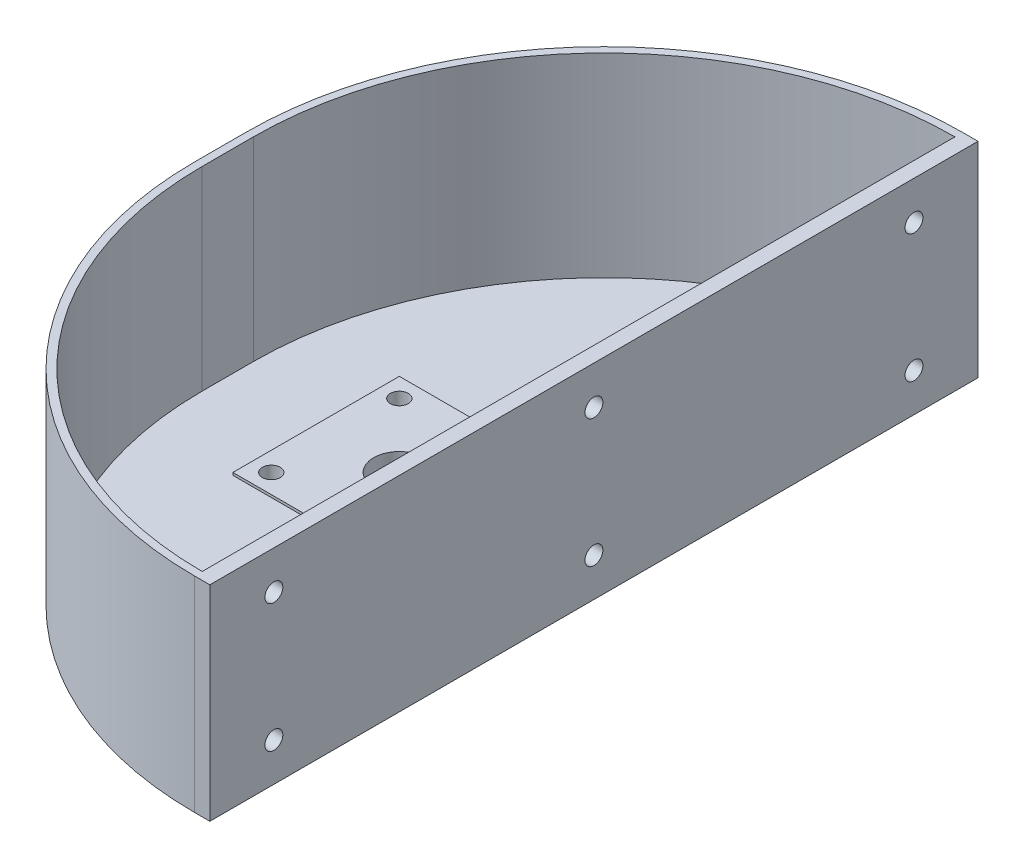
ISO-10303-21;
HEADER;
FILE_DESCRIPTION(('STEP AP214'),'2;1');
FILE_NAME('part.step','',(''),(''),'','','');
FILE_SCHEMA(('AUTOMOTIVE_DESIGN { 1 0 10303 214 1 1 1 1 }'));
ENDSEC;
DATA;
#1=APPLICATION_CONTEXT('core data for automotive mechanical design processes');
#2=APPLICATION_PROTOCOL_DEFINITION('international standard','automotive_design',2000,#1);
#3=PRODUCT_CONTEXT('',#1,'mechanical');
#4=PRODUCT('Part','Part','',(#3));
#5=PRODUCT_RELATED_PRODUCT_CATEGORY('part','',(#4));
#6=PRODUCT_DEFINITION_FORMATION('','',#4);
#7=PRODUCT_DEFINITION_CONTEXT('part definition',#1,'design');
#8=PRODUCT_DEFINITION('design','',#6,#7);
#9=PRODUCT_DEFINITION_SHAPE('','',#8);
#10=(LENGTH_UNIT() NAMED_UNIT(*) SI_UNIT(.MILLI.,.METRE.));
#11=(NAMED_UNIT(*) PLANE_ANGLE_UNIT() SI_UNIT($,.RADIAN.));
#12=(NAMED_UNIT(*) SI_UNIT($,.STERADIAN.) SOLID_ANGLE_UNIT());
#13=UNCERTAINTY_MEASURE_WITH_UNIT(LENGTH_MEASURE(1.E-05),#10,'distance_accuracy_value','');
#14=(GEOMETRIC_REPRESENTATION_CONTEXT(3) GLOBAL_UNCERTAINTY_ASSIGNED_CONTEXT((#13)) GLOBAL_UNIT_ASSIGNED_CONTEXT((#10,
#11,#12)) REPRESENTATION_CONTEXT('',''));
#15=CARTESIAN_POINT('',(0.,0.,0.));
#16=DIRECTION('',(0.,0.,1.));
#17=DIRECTION('',(1.,0.,0.));
#18=AXIS2_PLACEMENT_3D('',#15,#16,#17);
#19=CARTESIAN_POINT('',(0.,4.,0.));
#20=DIRECTION('',(0.,-1.,0.));
#21=DIRECTION('',(0.,0.,-1.));
#22=AXIS2_PLACEMENT_3D('',#19,#20,#21);
#23=PLANE('',#22);
#24=DIRECTION('',(0.,0.,1.));
#25=VECTOR('',#24,1.);
#26=CARTESIAN_POINT('',(-67.,4.,-9.99999999999998));
#27=LINE('',#26,#25);
#28=CARTESIAN_POINT('',(-67.,4.,-9.99999999999998));
#29=VERTEX_POINT('',#28);
#30=CARTESIAN_POINT('',(-67.,4.,9.99999999999996));
#31=VERTEX_POINT('',#30);
#32=EDGE_CURVE('E55',#29,#31,#27,.T.);
#33=ORIENTED_EDGE('',*,*,#32,.T.);
#34=CARTESIAN_POINT('',(70.,4.,9.99999999999998));
#35=DIRECTION('',(0.,1.,0.));
#36=DIRECTION('',(0.,0.,1.));
#37=AXIS2_PLACEMENT_3D('',#34,#35,#36);
#38=CIRCLE('',#37,137.);
#39=CARTESIAN_POINT('',(70.,4.,147.));
#40=VERTEX_POINT('',#39);
#41=EDGE_CURVE('E161',#31,#40,#38,.T.);
#42=ORIENTED_EDGE('',*,*,#41,.T.);
#43=DIRECTION('',(0.,0.,-1.));
#44=VECTOR('',#43,1.);
#45=CARTESIAN_POINT('',(70.,4.,150.));
#46=LINE('',#45,#44);
#47=CARTESIAN_POINT('',(70.,4.,-147.));
#48=VERTEX_POINT('',#47);
#49=EDGE_CURVE('E315',#40,#48,#46,.T.);
#50=ORIENTED_EDGE('',*,*,#49,.T.);
#51=CARTESIAN_POINT('',(70.,4.,-9.99999999999998));
#52=DIRECTION('',(0.,1.,0.));
#53=DIRECTION('',(0.,0.,1.));
#54=AXIS2_PLACEMENT_3D('',#51,#52,#53);
#55=CIRCLE('',#54,137.);
#56=EDGE_CURVE('E60',#48,#29,#55,.T.);
#57=ORIENTED_EDGE('',*,*,#56,.T.);
#58=EDGE_LOOP('',(#33,#42,#50,#57));
#59=FACE_BOUND('',#58,.T.);
#60=DIRECTION('',(0.,0.,-1.));
#61=VECTOR('',#60,1.);
#62=CARTESIAN_POINT('',(32.5,4.,32.5));
#63=LINE('',#62,#61);
#64=CARTESIAN_POINT('',(32.5,4.,32.5));
#65=VERTEX_POINT('',#64);
#66=CARTESIAN_POINT('',(32.5,4.,-32.5));
#67=VERTEX_POINT('',#66);
#68=EDGE_CURVE('E236',#65,#67,#63,.T.);
#69=ORIENTED_EDGE('',*,*,#68,.F.);
#70=DIRECTION('',(1.,0.,0.));
#71=VECTOR('',#70,1.);
#72=CARTESIAN_POINT('',(-32.5,4.,32.5));
#73=LINE('',#72,#71);
#74=CARTESIAN_POINT('',(-32.5,4.,32.5));
#75=VERTEX_POINT('',#74);
#76=EDGE_CURVE('E245',#75,#65,#73,.T.);
#77=ORIENTED_EDGE('',*,*,#76,.F.);
#78=DIRECTION('',(0.,0.,1.));
#79=VECTOR('',#78,1.);
#80=CARTESIAN_POINT('',(-32.5,4.,32.5));
#81=LINE('',#80,#79);
#82=CARTESIAN_POINT('',(-32.5,4.,-32.5));
#83=VERTEX_POINT('',#82);
#84=EDGE_CURVE('E262',#83,#75,#81,.T.);
#85=ORIENTED_EDGE('',*,*,#84,.F.);
#86=DIRECTION('',(-1.,0.,0.));
#87=VECTOR('',#86,1.);
#88=CARTESIAN_POINT('',(-32.5,4.,-32.5));
#89=LINE('',#88,#87);
#90=EDGE_CURVE('E258',#67,#83,#89,.T.);
#91=ORIENTED_EDGE('',*,*,#90,.F.);
#92=EDGE_LOOP('',(#69,#77,#85,#91));
#93=FACE_BOUND('',#92,.T.);
#94=ADVANCED_FACE('F39',(#59,#93),#23,.F.);
#95=CARTESIAN_POINT('',(-70.,4.,-150.));
#96=DIRECTION('',(0.,0.,1.));
#97=DIRECTION('',(1.,0.,0.));
#98=AXIS2_PLACEMENT_3D('',#95,#96,#97);
#99=PLANE('',#98);
#100=DIRECTION('',(-1.,0.,0.));
#101=VECTOR('',#100,1.);
#102=CARTESIAN_POINT('',(-70.,0.,-150.));
#103=LINE('',#102,#101);
#104=CARTESIAN_POINT('',(76.,0.,-150.));
#105=VERTEX_POINT('',#104);
#106=CARTESIAN_POINT('',(70.,0.,-150.));
#107=VERTEX_POINT('',#106);
#108=EDGE_CURVE('E314',#105,#107,#103,.T.);
#109=ORIENTED_EDGE('',*,*,#108,.T.);
#110=DIRECTION('',(0.,-1.,0.));
#111=VECTOR('',#110,1.);
#112=CARTESIAN_POINT('',(70.,80.,-150.));
#113=LINE('',#112,#111);
#114=CARTESIAN_POINT('',(70.,80.,-150.));
#115=VERTEX_POINT('',#114);
#116=EDGE_CURVE('E297',#115,#107,#113,.T.);
#117=ORIENTED_EDGE('',*,*,#116,.F.);
#118=DIRECTION('',(-1.,0.,0.));
#119=VECTOR('',#118,1.);
#120=CARTESIAN_POINT('',(70.,80.,-150.));
#121=LINE('',#120,#119);
#122=CARTESIAN_POINT('',(76.,80.,-150.));
#123=VERTEX_POINT('',#122);
#124=EDGE_CURVE('E166',#123,#115,#121,.T.);
#125=ORIENTED_EDGE('',*,*,#124,.F.);
#126=DIRECTION('',(0.,-1.,0.));
#127=VECTOR('',#126,1.);
#128=CARTESIAN_POINT('',(76.,80.,-150.));
#129=LINE('',#128,#127);
#130=EDGE_CURVE('E303',#123,#105,#129,.T.);
#131=ORIENTED_EDGE('',*,*,#130,.T.);
#132=EDGE_LOOP('',(#109,#117,#125,#131));
#133=FACE_BOUND('',#132,.T.);
#134=ADVANCED_FACE('F344',(#133),#99,.F.);
#135=CARTESIAN_POINT('',(-70.,4.,150.));
#136=DIRECTION('',(1.,0.,0.));
#137=DIRECTION('',(0.,0.,-1.));
#138=AXIS2_PLACEMENT_3D('',#135,#136,#137);
#139=PLANE('',#138);
#140=DIRECTION('',(0.,-1.,0.));
#141=VECTOR('',#140,1.);
#142=CARTESIAN_POINT('',(-70.,4.,9.99999999999998));
#143=LINE('',#142,#141);
#144=CARTESIAN_POINT('',(-70.,0.,9.99999999999998));
#145=VERTEX_POINT('',#144);
#146=CARTESIAN_POINT('',(-70.,80.,9.99999999999996));
#147=VERTEX_POINT('',#146);
#148=EDGE_CURVE('E150',#145,#147,#143,.F.);
#149=ORIENTED_EDGE('',*,*,#148,.T.);
#150=DIRECTION('',(0.,0.,1.));
#151=VECTOR('',#150,1.);
#152=CARTESIAN_POINT('',(-70.,80.,-9.99999999999998));
#153=LINE('',#152,#151);
#154=CARTESIAN_POINT('',(-70.,80.,-9.99999999999998));
#155=VERTEX_POINT('',#154);
#156=EDGE_CURVE('E153',#155,#147,#153,.T.);
#157=ORIENTED_EDGE('',*,*,#156,.F.);
#158=DIRECTION('',(0.,-1.,0.));
#159=VECTOR('',#158,1.);
#160=CARTESIAN_POINT('',(-70.,4.,-9.99999999999998));
#161=LINE('',#160,#159);
#162=CARTESIAN_POINT('',(-70.,0.,-9.99999999999998));
#163=VERTEX_POINT('',#162);
#164=EDGE_CURVE('E141',#155,#163,#161,.T.);
#165=ORIENTED_EDGE('',*,*,#164,.T.);
#166=DIRECTION('',(0.,0.,1.));
#167=VECTOR('',#166,1.);
#168=CARTESIAN_POINT('',(-70.,0.,150.));
#169=LINE('',#168,#167);
#170=EDGE_CURVE('E322',#163,#145,#169,.T.);
#171=ORIENTED_EDGE('',*,*,#170,.T.);
#172=EDGE_LOOP('',(#149,#157,#165,#171));
#173=FACE_BOUND('',#172,.T.);
#174=ADVANCED_FACE('F154',(#173),#139,.F.);
#175=CARTESIAN_POINT('',(-70.,4.,150.));
#176=DIRECTION('',(0.,0.,-1.));
#177=DIRECTION('',(-1.,0.,0.));
#178=AXIS2_PLACEMENT_3D('',#175,#176,#177);
#179=PLANE('',#178);
#180=DIRECTION('',(0.,-1.,0.));
#181=VECTOR('',#180,1.);
#182=CARTESIAN_POINT('',(70.,80.,150.));
#183=LINE('',#182,#181);
#184=CARTESIAN_POINT('',(70.,80.,150.));
#185=VERTEX_POINT('',#184);
#186=CARTESIAN_POINT('',(70.,0.,150.));
#187=VERTEX_POINT('',#186);
#188=EDGE_CURVE('E311',#185,#187,#183,.T.);
#189=ORIENTED_EDGE('',*,*,#188,.T.);
#190=DIRECTION('',(1.,0.,0.));
#191=VECTOR('',#190,1.);
#192=CARTESIAN_POINT('',(-70.,0.,150.));
#193=LINE('',#192,#191);
#194=CARTESIAN_POINT('',(76.,0.,150.));
#195=VERTEX_POINT('',#194);
#196=EDGE_CURVE('E318',#187,#195,#193,.T.);
#197=ORIENTED_EDGE('',*,*,#196,.T.);
#198=DIRECTION('',(0.,-1.,0.));
#199=VECTOR('',#198,1.);
#200=CARTESIAN_POINT('',(76.,80.,150.));
#201=LINE('',#200,#199);
#202=CARTESIAN_POINT('',(76.,80.,150.));
#203=VERTEX_POINT('',#202);
#204=EDGE_CURVE('E307',#203,#195,#201,.T.);
#205=ORIENTED_EDGE('',*,*,#204,.F.);
#206=DIRECTION('',(1.,0.,0.));
#207=VECTOR('',#206,1.);
#208=CARTESIAN_POINT('',(70.,80.,150.));
#209=LINE('',#208,#207);
#210=EDGE_CURVE('E289',#185,#203,#209,.T.);
#211=ORIENTED_EDGE('',*,*,#210,.F.);
#212=EDGE_LOOP('',(#189,#197,#205,#211));
#213=FACE_BOUND('',#212,.T.);
#214=ADVANCED_FACE('F340',(#213),#179,.F.);
#215=CARTESIAN_POINT('',(0.,0.,0.));
#216=DIRECTION('',(0.,-1.,0.));
#217=DIRECTION('',(0.,0.,-1.));
#218=AXIS2_PLACEMENT_3D('',#215,#216,#217);
#219=PLANE('',#218);
#220=CARTESIAN_POINT('',(25.,0.,-25.));
#221=DIRECTION('',(0.,1.,0.));
#222=DIRECTION('',(0.,0.,1.));
#223=AXIS2_PLACEMENT_3D('',#220,#221,#222);
#224=CIRCLE('',#223,3.5);
#225=CARTESIAN_POINT('',(25.,0.,-21.5));
#226=VERTEX_POINT('',#225);
#227=EDGE_CURVE('E216',#226,#226,#224,.T.);
#228=ORIENTED_EDGE('',*,*,#227,.T.);
#229=EDGE_LOOP('',(#228));
#230=FACE_BOUND('',#229,.T.);
#231=CARTESIAN_POINT('',(-25.,0.,25.));
#232=DIRECTION('',(0.,1.,0.));
#233=DIRECTION('',(0.,0.,1.));
#234=AXIS2_PLACEMENT_3D('',#231,#232,#233);
#235=CIRCLE('',#234,3.5);
#236=CARTESIAN_POINT('',(-25.,0.,28.5));
#237=VERTEX_POINT('',#236);
#238=EDGE_CURVE('E225',#237,#237,#235,.T.);
#239=ORIENTED_EDGE('',*,*,#238,.T.);
#240=EDGE_LOOP('',(#239));
#241=FACE_BOUND('',#240,.T.);
#242=CARTESIAN_POINT('',(25.,0.,25.));
#243=DIRECTION('',(0.,1.,0.));
#244=DIRECTION('',(0.,0.,1.));
#245=AXIS2_PLACEMENT_3D('',#242,#243,#244);
#246=CIRCLE('',#245,3.5);
#247=CARTESIAN_POINT('',(25.,0.,28.5));
#248=VERTEX_POINT('',#247);
#249=EDGE_CURVE('E204',#248,#248,#246,.T.);
#250=ORIENTED_EDGE('',*,*,#249,.T.);
#251=EDGE_LOOP('',(#250));
#252=FACE_BOUND('',#251,.T.);
#253=CARTESIAN_POINT('',(0.,0.,0.));
#254=DIRECTION('',(0.,1.,0.));
#255=DIRECTION('',(0.,0.,1.));
#256=AXIS2_PLACEMENT_3D('',#253,#254,#255);
#257=CIRCLE('',#256,10.);
#258=CARTESIAN_POINT('',(0.,0.,10.));
#259=VERTEX_POINT('',#258);
#260=EDGE_CURVE('E174',#259,#259,#257,.T.);
#261=ORIENTED_EDGE('',*,*,#260,.T.);
#262=EDGE_LOOP('',(#261));
#263=FACE_BOUND('',#262,.T.);
#264=CARTESIAN_POINT('',(-25.,0.,-25.));
#265=DIRECTION('',(0.,1.,0.));
#266=DIRECTION('',(0.,0.,1.));
#267=AXIS2_PLACEMENT_3D('',#264,#265,#266);
#268=CIRCLE('',#267,3.5);
#269=CARTESIAN_POINT('',(-25.,0.,-21.5));
#270=VERTEX_POINT('',#269);
#271=EDGE_CURVE('E232',#270,#270,#268,.T.);
#272=ORIENTED_EDGE('',*,*,#271,.T.);
#273=EDGE_LOOP('',(#272));
#274=FACE_BOUND('',#273,.T.);
#275=ORIENTED_EDGE('',*,*,#170,.F.);
#276=CARTESIAN_POINT('',(70.,0.,-9.99999999999998));
#277=DIRECTION('',(0.,-1.,0.));
#278=DIRECTION('',(0.,0.,-1.));
#279=AXIS2_PLACEMENT_3D('',#276,#277,#278);
#280=CIRCLE('',#279,140.);
#281=EDGE_CURVE('E11',#163,#107,#280,.T.);
#282=ORIENTED_EDGE('',*,*,#281,.T.);
#283=ORIENTED_EDGE('',*,*,#108,.F.);
#284=DIRECTION('',(0.,0.,-1.));
#285=VECTOR('',#284,1.);
#286=CARTESIAN_POINT('',(76.,0.,-150.));
#287=LINE('',#286,#285);
#288=EDGE_CURVE('E284',#195,#105,#287,.T.);
#289=ORIENTED_EDGE('',*,*,#288,.F.);
#290=ORIENTED_EDGE('',*,*,#196,.F.);
#291=CARTESIAN_POINT('',(70.,0.,9.99999999999998));
#292=DIRECTION('',(0.,-1.,0.));
#293=DIRECTION('',(0.,0.,-1.));
#294=AXIS2_PLACEMENT_3D('',#291,#292,#293);
#295=CIRCLE('',#294,140.);
#296=EDGE_CURVE('E48',#187,#145,#295,.T.);
#297=ORIENTED_EDGE('',*,*,#296,.T.);
#298=EDGE_LOOP('',(#275,#282,#283,#289,#290,#297));
#299=FACE_BOUND('',#298,.T.);
#300=ADVANCED_FACE('F332',(#230,#241,#252,#263,#274,#299),#219,.T.);
#301=CARTESIAN_POINT('',(70.,80.,-150.));
#302=DIRECTION('',(1.,0.,0.));
#303=DIRECTION('',(0.,0.,-1.));
#304=AXIS2_PLACEMENT_3D('',#301,#302,#303);
#305=PLANE('',#304);
#306=CARTESIAN_POINT('',(70.,15.,0.));
#307=DIRECTION('',(1.,0.,0.));
#308=DIRECTION('',(0.,0.,-1.));
#309=AXIS2_PLACEMENT_3D('',#306,#307,#308);
#310=CIRCLE('',#309,3.5);
#311=CARTESIAN_POINT('',(70.,15.,-3.50000000000001));
#312=VERTEX_POINT('',#311);
#313=EDGE_CURVE('E192',#312,#312,#310,.T.);
#314=ORIENTED_EDGE('',*,*,#313,.T.);
#315=EDGE_LOOP('',(#314));
#316=FACE_BOUND('',#315,.T.);
#317=CARTESIAN_POINT('',(70.,65.,-125.));
#318=DIRECTION('',(1.,0.,0.));
#319=DIRECTION('',(0.,0.,-1.));
#320=AXIS2_PLACEMENT_3D('',#317,#318,#319);
#321=CIRCLE('',#320,3.49999999999999);
#322=CARTESIAN_POINT('',(70.,65.,-128.5));
#323=VERTEX_POINT('',#322);
#324=EDGE_CURVE('E688',#323,#323,#321,.T.);
#325=ORIENTED_EDGE('',*,*,#324,.T.);
#326=EDGE_LOOP('',(#325));
#327=FACE_BOUND('',#326,.T.);
#328=CARTESIAN_POINT('',(70.,65.,125.));
#329=DIRECTION('',(1.,0.,0.));
#330=DIRECTION('',(0.,0.,-1.));
#331=AXIS2_PLACEMENT_3D('',#328,#329,#330);
#332=CIRCLE('',#331,3.50000000000001);
#333=CARTESIAN_POINT('',(70.,65.,121.5));
#334=VERTEX_POINT('',#333);
#335=EDGE_CURVE('E692',#334,#334,#332,.T.);
#336=ORIENTED_EDGE('',*,*,#335,.T.);
#337=EDGE_LOOP('',(#336));
#338=FACE_BOUND('',#337,.T.);
#339=CARTESIAN_POINT('',(70.,15.,125.));
#340=DIRECTION('',(1.,0.,0.));
#341=DIRECTION('',(0.,0.,-1.));
#342=AXIS2_PLACEMENT_3D('',#339,#340,#341);
#343=CIRCLE('',#342,3.50000000000001);
#344=CARTESIAN_POINT('',(70.,15.,121.5));
#345=VERTEX_POINT('',#344);
#346=EDGE_CURVE('E696',#345,#345,#343,.T.);
#347=ORIENTED_EDGE('',*,*,#346,.T.);
#348=EDGE_LOOP('',(#347));
#349=FACE_BOUND('',#348,.T.);
#350=CARTESIAN_POINT('',(70.,15.,-125.));
#351=DIRECTION('',(1.,0.,0.));
#352=DIRECTION('',(0.,0.,-1.));
#353=AXIS2_PLACEMENT_3D('',#350,#351,#352);
#354=CIRCLE('',#353,3.49999999999999);
#355=CARTESIAN_POINT('',(70.,15.,-128.5));
#356=VERTEX_POINT('',#355);
#357=EDGE_CURVE('E700',#356,#356,#354,.T.);
#358=ORIENTED_EDGE('',*,*,#357,.T.);
#359=EDGE_LOOP('',(#358));
#360=FACE_BOUND('',#359,.T.);
#361=CARTESIAN_POINT('',(70.,65.,0.));
#362=DIRECTION('',(1.,0.,0.));
#363=DIRECTION('',(0.,0.,-1.));
#364=AXIS2_PLACEMENT_3D('',#361,#362,#363);
#365=CIRCLE('',#364,3.5);
#366=CARTESIAN_POINT('',(70.,65.,-3.50000000000001));
#367=VERTEX_POINT('',#366);
#368=EDGE_CURVE('E704',#367,#367,#365,.T.);
#369=ORIENTED_EDGE('',*,*,#368,.T.);
#370=EDGE_LOOP('',(#369));
#371=FACE_BOUND('',#370,.T.);
#372=ORIENTED_EDGE('',*,*,#49,.F.);
#373=DIRECTION('',(0.,-1.,0.));
#374=VECTOR('',#373,1.);
#375=CARTESIAN_POINT('',(70.,411.058907144937,147.));
#376=LINE('',#375,#374);
#377=CARTESIAN_POINT('',(70.,80.,147.));
#378=VERTEX_POINT('',#377);
#379=EDGE_CURVE('E188',#378,#40,#376,.T.);
#380=ORIENTED_EDGE('',*,*,#379,.F.);
#381=DIRECTION('',(0.,0.,1.));
#382=VECTOR('',#381,1.);
#383=CARTESIAN_POINT('',(70.,80.,-150.));
#384=LINE('',#383,#382);
#385=CARTESIAN_POINT('',(70.,80.,-147.));
#386=VERTEX_POINT('',#385);
#387=EDGE_CURVE('E285',#386,#378,#384,.T.);
#388=ORIENTED_EDGE('',*,*,#387,.F.);
#389=DIRECTION('',(0.,-1.,0.));
#390=VECTOR('',#389,1.);
#391=CARTESIAN_POINT('',(70.,411.058907144937,-147.));
#392=LINE('',#391,#390);
#393=EDGE_CURVE('E201',#386,#48,#392,.T.);
#394=ORIENTED_EDGE('',*,*,#393,.T.);
#395=EDGE_LOOP('',(#372,#380,#388,#394));
#396=FACE_BOUND('',#395,.T.);
#397=ADVANCED_FACE('F364',(#316,#327,#338,#349,#360,#371,#396),#305,.F.);
#398=CARTESIAN_POINT('',(76.,80.,-150.));
#399=DIRECTION('',(-1.,0.,0.));
#400=DIRECTION('',(0.,0.,1.));
#401=AXIS2_PLACEMENT_3D('',#398,#399,#400);
#402=PLANE('',#401);
#403=CARTESIAN_POINT('',(76.,15.,0.));
#404=DIRECTION('',(1.,0.,0.));
#405=DIRECTION('',(0.,0.,1.));
#406=AXIS2_PLACEMENT_3D('',#403,#404,#405);
#407=CIRCLE('',#406,3.5);
#408=CARTESIAN_POINT('',(76.,15.,3.49999999999999));
#409=VERTEX_POINT('',#408);
#410=EDGE_CURVE('E712',#409,#409,#407,.T.);
#411=ORIENTED_EDGE('',*,*,#410,.F.);
#412=EDGE_LOOP('',(#411));
#413=FACE_BOUND('',#412,.T.);
#414=CARTESIAN_POINT('',(76.,65.,-125.));
#415=DIRECTION('',(1.,0.,0.));
#416=DIRECTION('',(0.,0.,-1.));
#417=AXIS2_PLACEMENT_3D('',#414,#415,#416);
#418=CIRCLE('',#417,3.49999999999999);
#419=CARTESIAN_POINT('',(76.,65.,-128.5));
#420=VERTEX_POINT('',#419);
#421=EDGE_CURVE('E722',#420,#420,#418,.T.);
#422=ORIENTED_EDGE('',*,*,#421,.F.);
#423=EDGE_LOOP('',(#422));
#424=FACE_BOUND('',#423,.T.);
#425=CARTESIAN_POINT('',(76.,65.,125.));
#426=DIRECTION('',(1.,0.,0.));
#427=DIRECTION('',(0.,0.,1.));
#428=AXIS2_PLACEMENT_3D('',#425,#426,#427);
#429=CIRCLE('',#428,3.50000000000001);
#430=CARTESIAN_POINT('',(76.,65.,128.5));
#431=VERTEX_POINT('',#430);
#432=EDGE_CURVE('E717',#431,#431,#429,.T.);
#433=ORIENTED_EDGE('',*,*,#432,.F.);
#434=EDGE_LOOP('',(#433));
#435=FACE_BOUND('',#434,.T.);
#436=CARTESIAN_POINT('',(76.,15.,125.));
#437=DIRECTION('',(1.,0.,0.));
#438=DIRECTION('',(0.,0.,-1.));
#439=AXIS2_PLACEMENT_3D('',#436,#437,#438);
#440=CIRCLE('',#439,3.50000000000001);
#441=CARTESIAN_POINT('',(76.,15.,121.5));
#442=VERTEX_POINT('',#441);
#443=EDGE_CURVE('E713',#442,#442,#440,.T.);
#444=ORIENTED_EDGE('',*,*,#443,.F.);
#445=EDGE_LOOP('',(#444));
#446=FACE_BOUND('',#445,.T.);
#447=CARTESIAN_POINT('',(76.,15.,-125.));
#448=DIRECTION('',(1.,0.,0.));
#449=DIRECTION('',(0.,0.,1.));
#450=AXIS2_PLACEMENT_3D('',#447,#448,#449);
#451=CIRCLE('',#450,3.49999999999999);
#452=CARTESIAN_POINT('',(76.,15.,-121.5));
#453=VERTEX_POINT('',#452);
#454=EDGE_CURVE('E718',#453,#453,#451,.T.);
#455=ORIENTED_EDGE('',*,*,#454,.F.);
#456=EDGE_LOOP('',(#455));
#457=FACE_BOUND('',#456,.T.);
#458=CARTESIAN_POINT('',(76.,65.,0.));
#459=DIRECTION('',(1.,0.,0.));
#460=DIRECTION('',(0.,0.,-1.));
#461=AXIS2_PLACEMENT_3D('',#458,#459,#460);
#462=CIRCLE('',#461,3.5);
#463=CARTESIAN_POINT('',(76.,65.,-3.50000000000001));
#464=VERTEX_POINT('',#463);
#465=EDGE_CURVE('E708',#464,#464,#462,.T.);
#466=ORIENTED_EDGE('',*,*,#465,.F.);
#467=EDGE_LOOP('',(#466));
#468=FACE_BOUND('',#467,.T.);
#469=ORIENTED_EDGE('',*,*,#288,.T.);
#470=ORIENTED_EDGE('',*,*,#130,.F.);
#471=DIRECTION('',(0.,0.,-1.));
#472=VECTOR('',#471,1.);
#473=CARTESIAN_POINT('',(76.,80.,-150.));
#474=LINE('',#473,#472);
#475=EDGE_CURVE('E292',#203,#123,#474,.T.);
#476=ORIENTED_EDGE('',*,*,#475,.F.);
#477=ORIENTED_EDGE('',*,*,#204,.T.);
#478=EDGE_LOOP('',(#469,#470,#476,#477));
#479=FACE_BOUND('',#478,.T.);
#480=ADVANCED_FACE('F342',(#413,#424,#435,#446,#457,#468,#479),#402,.F.);
#481=CARTESIAN_POINT('',(0.,80.,0.));
#482=DIRECTION('',(0.,1.,0.));
#483=DIRECTION('',(0.,0.,1.));
#484=AXIS2_PLACEMENT_3D('',#481,#482,#483);
#485=PLANE('',#484);
#486=CARTESIAN_POINT('',(70.,80.,9.99999999999998));
#487=DIRECTION('',(0.,1.,0.));
#488=DIRECTION('',(0.,0.,1.));
#489=AXIS2_PLACEMENT_3D('',#486,#487,#488);
#490=CIRCLE('',#489,140.);
#491=EDGE_CURVE('E160',#147,#185,#490,.T.);
#492=ORIENTED_EDGE('',*,*,#491,.T.);
#493=ORIENTED_EDGE('',*,*,#210,.T.);
#494=ORIENTED_EDGE('',*,*,#475,.T.);
#495=ORIENTED_EDGE('',*,*,#124,.T.);
#496=CARTESIAN_POINT('',(70.,80.,-9.99999999999998));
#497=DIRECTION('',(0.,1.,0.));
#498=DIRECTION('',(0.,0.,1.));
#499=AXIS2_PLACEMENT_3D('',#496,#497,#498);
#500=CIRCLE('',#499,140.);
#501=EDGE_CURVE('E145',#115,#155,#500,.T.);
#502=ORIENTED_EDGE('',*,*,#501,.T.);
#503=ORIENTED_EDGE('',*,*,#156,.T.);
#504=EDGE_LOOP('',(#492,#493,#494,#495,#502,#503));
#505=FACE_BOUND('',#504,.T.);
#506=ORIENTED_EDGE('',*,*,#387,.T.);
#507=CARTESIAN_POINT('',(70.,80.,9.99999999999998));
#508=DIRECTION('',(0.,1.,0.));
#509=DIRECTION('',(0.,0.,1.));
#510=AXIS2_PLACEMENT_3D('',#507,#508,#509);
#511=CIRCLE('',#510,137.);
#512=CARTESIAN_POINT('',(-67.,80.,9.99999999999996));
#513=VERTEX_POINT('',#512);
#514=EDGE_CURVE('E189',#513,#378,#511,.T.);
#515=ORIENTED_EDGE('',*,*,#514,.F.);
#516=DIRECTION('',(0.,0.,1.));
#517=VECTOR('',#516,1.);
#518=CARTESIAN_POINT('',(-67.,80.,-9.99999999999998));
#519=LINE('',#518,#517);
#520=CARTESIAN_POINT('',(-67.,80.,-9.99999999999998));
#521=VERTEX_POINT('',#520);
#522=EDGE_CURVE('E185',#521,#513,#519,.T.);
#523=ORIENTED_EDGE('',*,*,#522,.F.);
#524=CARTESIAN_POINT('',(70.,80.,-9.99999999999998));
#525=DIRECTION('',(0.,1.,0.));
#526=DIRECTION('',(0.,0.,1.));
#527=AXIS2_PLACEMENT_3D('',#524,#525,#526);
#528=CIRCLE('',#527,137.);
#529=EDGE_CURVE('E180',#386,#521,#528,.T.);
#530=ORIENTED_EDGE('',*,*,#529,.F.);
#531=EDGE_LOOP('',(#506,#515,#523,#530));
#532=FACE_BOUND('',#531,.T.);
#533=ADVANCED_FACE('F163',(#505,#532),#485,.T.);
#534=CARTESIAN_POINT('',(70.,4.,-9.99999999999998));
#535=DIRECTION('',(0.,-1.,0.));
#536=DIRECTION('',(0.,0.,-1.));
#537=AXIS2_PLACEMENT_3D('',#534,#535,#536);
#538=CYLINDRICAL_SURFACE('',#537,140.);
#539=ORIENTED_EDGE('',*,*,#164,.F.);
#540=ORIENTED_EDGE('',*,*,#501,.F.);
#541=ORIENTED_EDGE('',*,*,#116,.T.);
#542=ORIENTED_EDGE('',*,*,#281,.F.);
#543=EDGE_LOOP('',(#539,#540,#541,#542));
#544=FACE_BOUND('',#543,.T.);
#545=ADVANCED_FACE('F143',(#544),#538,.T.);
#546=CARTESIAN_POINT('',(70.,4.,9.99999999999998));
#547=DIRECTION('',(0.,-1.,0.));
#548=DIRECTION('',(0.,0.,-1.));
#549=AXIS2_PLACEMENT_3D('',#546,#547,#548);
#550=CYLINDRICAL_SURFACE('',#549,140.);
#551=ORIENTED_EDGE('',*,*,#296,.F.);
#552=ORIENTED_EDGE('',*,*,#188,.F.);
#553=ORIENTED_EDGE('',*,*,#491,.F.);
#554=ORIENTED_EDGE('',*,*,#148,.F.);
#555=EDGE_LOOP('',(#551,#552,#553,#554));
#556=FACE_BOUND('',#555,.T.);
#557=ADVANCED_FACE('F41',(#556),#550,.T.);
#558=CARTESIAN_POINT('',(32.5,5.,32.5));
#559=DIRECTION('',(-1.,0.,0.));
#560=DIRECTION('',(0.,0.,1.));
#561=AXIS2_PLACEMENT_3D('',#558,#559,#560);
#562=PLANE('',#561);
#563=ORIENTED_EDGE('',*,*,#68,.T.);
#564=DIRECTION('',(0.,-1.,0.));
#565=VECTOR('',#564,1.);
#566=CARTESIAN_POINT('',(32.5,5.,-32.5));
#567=LINE('',#566,#565);
#568=CARTESIAN_POINT('',(32.5,5.,-32.5));
#569=VERTEX_POINT('',#568);
#570=EDGE_CURVE('E280',#569,#67,#567,.T.);
#571=ORIENTED_EDGE('',*,*,#570,.F.);
#572=DIRECTION('',(0.,0.,-1.));
#573=VECTOR('',#572,1.);
#574=CARTESIAN_POINT('',(32.5,5.,32.5));
#575=LINE('',#574,#573);
#576=CARTESIAN_POINT('',(32.5,5.,32.5));
#577=VERTEX_POINT('',#576);
#578=EDGE_CURVE('E240',#577,#569,#575,.T.);
#579=ORIENTED_EDGE('',*,*,#578,.F.);
#580=DIRECTION('',(0.,-1.,0.));
#581=VECTOR('',#580,1.);
#582=CARTESIAN_POINT('',(32.5,5.,32.5));
#583=LINE('',#582,#581);
#584=EDGE_CURVE('E254',#577,#65,#583,.T.);
#585=ORIENTED_EDGE('',*,*,#584,.T.);
#586=EDGE_LOOP('',(#563,#571,#579,#585));
#587=FACE_BOUND('',#586,.T.);
#588=ADVANCED_FACE('F359',(#587),#562,.F.);
#589=CARTESIAN_POINT('',(-32.5,5.,-32.5));
#590=DIRECTION('',(0.,0.,1.));
#591=DIRECTION('',(1.,0.,0.));
#592=AXIS2_PLACEMENT_3D('',#589,#590,#591);
#593=PLANE('',#592);
#594=ORIENTED_EDGE('',*,*,#90,.T.);
#595=DIRECTION('',(0.,-1.,0.));
#596=VECTOR('',#595,1.);
#597=CARTESIAN_POINT('',(-32.5,5.,-32.5));
#598=LINE('',#597,#596);
#599=CARTESIAN_POINT('',(-32.5,5.,-32.5));
#600=VERTEX_POINT('',#599);
#601=EDGE_CURVE('E276',#600,#83,#598,.T.);
#602=ORIENTED_EDGE('',*,*,#601,.F.);
#603=DIRECTION('',(-1.,0.,0.));
#604=VECTOR('',#603,1.);
#605=CARTESIAN_POINT('',(-32.5,5.,-32.5));
#606=LINE('',#605,#604);
#607=EDGE_CURVE('E244',#569,#600,#606,.T.);
#608=ORIENTED_EDGE('',*,*,#607,.F.);
#609=ORIENTED_EDGE('',*,*,#570,.T.);
#610=EDGE_LOOP('',(#594,#602,#608,#609));
#611=FACE_BOUND('',#610,.T.);
#612=ADVANCED_FACE('F506',(#611),#593,.F.);
#613=CARTESIAN_POINT('',(-32.5,5.,32.5));
#614=DIRECTION('',(1.,0.,0.));
#615=DIRECTION('',(0.,0.,-1.));
#616=AXIS2_PLACEMENT_3D('',#613,#614,#615);
#617=PLANE('',#616);
#618=ORIENTED_EDGE('',*,*,#84,.T.);
#619=DIRECTION('',(0.,-1.,0.));
#620=VECTOR('',#619,1.);
#621=CARTESIAN_POINT('',(-32.5,5.,32.5));
#622=LINE('',#621,#620);
#623=CARTESIAN_POINT('',(-32.5,5.,32.5));
#624=VERTEX_POINT('',#623);
#625=EDGE_CURVE('E272',#624,#75,#622,.T.);
#626=ORIENTED_EDGE('',*,*,#625,.F.);
#627=DIRECTION('',(0.,0.,1.));
#628=VECTOR('',#627,1.);
#629=CARTESIAN_POINT('',(-32.5,5.,32.5));
#630=LINE('',#629,#628);
#631=EDGE_CURVE('E248',#600,#624,#630,.T.);
#632=ORIENTED_EDGE('',*,*,#631,.F.);
#633=ORIENTED_EDGE('',*,*,#601,.T.);
#634=EDGE_LOOP('',(#618,#626,#632,#633));
#635=FACE_BOUND('',#634,.T.);
#636=ADVANCED_FACE('F503',(#635),#617,.F.);
#637=CARTESIAN_POINT('',(-32.5,5.,32.5));
#638=DIRECTION('',(0.,0.,-1.));
#639=DIRECTION('',(-1.,0.,0.));
#640=AXIS2_PLACEMENT_3D('',#637,#638,#639);
#641=PLANE('',#640);
#642=ORIENTED_EDGE('',*,*,#76,.T.);
#643=ORIENTED_EDGE('',*,*,#584,.F.);
#644=DIRECTION('',(1.,0.,0.));
#645=VECTOR('',#644,1.);
#646=CARTESIAN_POINT('',(-32.5,5.,32.5));
#647=LINE('',#646,#645);
#648=EDGE_CURVE('E251',#624,#577,#647,.T.);
#649=ORIENTED_EDGE('',*,*,#648,.F.);
#650=ORIENTED_EDGE('',*,*,#625,.T.);
#651=EDGE_LOOP('',(#642,#643,#649,#650));
#652=FACE_BOUND('',#651,.T.);
#653=ADVANCED_FACE('F499',(#652),#641,.F.);
#654=CARTESIAN_POINT('',(0.,5.,0.));
#655=DIRECTION('',(0.,-1.,0.));
#656=DIRECTION('',(0.,0.,-1.));
#657=AXIS2_PLACEMENT_3D('',#654,#655,#656);
#658=PLANE('',#657);
#659=CARTESIAN_POINT('',(25.,5.,-25.));
#660=DIRECTION('',(0.,1.,0.));
#661=DIRECTION('',(0.,0.,1.));
#662=AXIS2_PLACEMENT_3D('',#659,#660,#661);
#663=CIRCLE('',#662,3.5);
#664=CARTESIAN_POINT('',(25.,5.,-21.5));
#665=VERTEX_POINT('',#664);
#666=EDGE_CURVE('E221',#665,#665,#663,.T.);
#667=ORIENTED_EDGE('',*,*,#666,.F.);
#668=EDGE_LOOP('',(#667));
#669=FACE_BOUND('',#668,.T.);
#670=CARTESIAN_POINT('',(-25.,5.,25.));
#671=DIRECTION('',(0.,1.,0.));
#672=DIRECTION('',(0.,0.,1.));
#673=AXIS2_PLACEMENT_3D('',#670,#671,#672);
#674=CIRCLE('',#673,3.5);
#675=CARTESIAN_POINT('',(-25.,5.,28.5));
#676=VERTEX_POINT('',#675);
#677=EDGE_CURVE('E208',#676,#676,#674,.T.);
#678=ORIENTED_EDGE('',*,*,#677,.F.);
#679=EDGE_LOOP('',(#678));
#680=FACE_BOUND('',#679,.T.);
#681=CARTESIAN_POINT('',(25.,5.,25.));
#682=DIRECTION('',(0.,1.,0.));
#683=DIRECTION('',(0.,0.,1.));
#684=AXIS2_PLACEMENT_3D('',#681,#682,#683);
#685=CIRCLE('',#684,3.5);
#686=CARTESIAN_POINT('',(25.,5.,28.5));
#687=VERTEX_POINT('',#686);
#688=EDGE_CURVE('E209',#687,#687,#685,.T.);
#689=ORIENTED_EDGE('',*,*,#688,.F.);
#690=EDGE_LOOP('',(#689));
#691=FACE_BOUND('',#690,.T.);
#692=CARTESIAN_POINT('',(0.,5.,0.));
#693=DIRECTION('',(0.,1.,0.));
#694=DIRECTION('',(0.,0.,1.));
#695=AXIS2_PLACEMENT_3D('',#692,#693,#694);
#696=CIRCLE('',#695,10.);
#697=CARTESIAN_POINT('',(0.,5.,10.));
#698=VERTEX_POINT('',#697);
#699=EDGE_CURVE('E169',#698,#698,#696,.T.);
#700=ORIENTED_EDGE('',*,*,#699,.F.);
#701=EDGE_LOOP('',(#700));
#702=FACE_BOUND('',#701,.T.);
#703=CARTESIAN_POINT('',(-25.,5.,-25.));
#704=DIRECTION('',(0.,1.,0.));
#705=DIRECTION('',(0.,0.,1.));
#706=AXIS2_PLACEMENT_3D('',#703,#704,#705);
#707=CIRCLE('',#706,3.5);
#708=CARTESIAN_POINT('',(-25.,5.,-21.5));
#709=VERTEX_POINT('',#708);
#710=EDGE_CURVE('E220',#709,#709,#707,.T.);
#711=ORIENTED_EDGE('',*,*,#710,.F.);
#712=EDGE_LOOP('',(#711));
#713=FACE_BOUND('',#712,.T.);
#714=ORIENTED_EDGE('',*,*,#578,.T.);
#715=ORIENTED_EDGE('',*,*,#607,.T.);
#716=ORIENTED_EDGE('',*,*,#631,.T.);
#717=ORIENTED_EDGE('',*,*,#648,.T.);
#718=EDGE_LOOP('',(#714,#715,#716,#717));
#719=FACE_BOUND('',#718,.T.);
#720=ADVANCED_FACE('F495',(#669,#680,#691,#702,#713,#719),#658,.F.);
#721=CARTESIAN_POINT('',(-25.,0.,-25.));
#722=DIRECTION('',(0.,1.,0.));
#723=DIRECTION('',(0.,0.,1.));
#724=AXIS2_PLACEMENT_3D('',#721,#722,#723);
#725=CYLINDRICAL_SURFACE('',#724,3.5);
#726=ORIENTED_EDGE('',*,*,#271,.F.);
#727=EDGE_LOOP('',(#726));
#728=FACE_BOUND('',#727,.T.);
#729=ORIENTED_EDGE('',*,*,#710,.T.);
#730=EDGE_LOOP('',(#729));
#731=FACE_BOUND('',#730,.T.);
#732=ADVANCED_FACE('F485',(#728,#731),#725,.F.);
#733=CARTESIAN_POINT('',(0.,0.,0.));
#734=DIRECTION('',(0.,1.,0.));
#735=DIRECTION('',(0.,0.,1.));
#736=AXIS2_PLACEMENT_3D('',#733,#734,#735);
#737=CYLINDRICAL_SURFACE('',#736,10.);
#738=ORIENTED_EDGE('',*,*,#260,.F.);
#739=EDGE_LOOP('',(#738));
#740=FACE_BOUND('',#739,.T.);
#741=ORIENTED_EDGE('',*,*,#699,.T.);
#742=EDGE_LOOP('',(#741));
#743=FACE_BOUND('',#742,.T.);
#744=ADVANCED_FACE('F481',(#740,#743),#737,.F.);
#745=CARTESIAN_POINT('',(25.,0.,25.));
#746=DIRECTION('',(0.,1.,0.));
#747=DIRECTION('',(0.,0.,1.));
#748=AXIS2_PLACEMENT_3D('',#745,#746,#747);
#749=CYLINDRICAL_SURFACE('',#748,3.5);
#750=ORIENTED_EDGE('',*,*,#249,.F.);
#751=EDGE_LOOP('',(#750));
#752=FACE_BOUND('',#751,.T.);
#753=ORIENTED_EDGE('',*,*,#688,.T.);
#754=EDGE_LOOP('',(#753));
#755=FACE_BOUND('',#754,.T.);
#756=ADVANCED_FACE('F477',(#752,#755),#749,.F.);
#757=CARTESIAN_POINT('',(-25.,0.,25.));
#758=DIRECTION('',(0.,1.,0.));
#759=DIRECTION('',(0.,0.,1.));
#760=AXIS2_PLACEMENT_3D('',#757,#758,#759);
#761=CYLINDRICAL_SURFACE('',#760,3.5);
#762=ORIENTED_EDGE('',*,*,#238,.F.);
#763=EDGE_LOOP('',(#762));
#764=FACE_BOUND('',#763,.T.);
#765=ORIENTED_EDGE('',*,*,#677,.T.);
#766=EDGE_LOOP('',(#765));
#767=FACE_BOUND('',#766,.T.);
#768=ADVANCED_FACE('F480',(#764,#767),#761,.F.);
#769=CARTESIAN_POINT('',(25.,0.,-25.));
#770=DIRECTION('',(0.,1.,0.));
#771=DIRECTION('',(0.,0.,1.));
#772=AXIS2_PLACEMENT_3D('',#769,#770,#771);
#773=CYLINDRICAL_SURFACE('',#772,3.5);
#774=ORIENTED_EDGE('',*,*,#227,.F.);
#775=EDGE_LOOP('',(#774));
#776=FACE_BOUND('',#775,.T.);
#777=ORIENTED_EDGE('',*,*,#666,.T.);
#778=EDGE_LOOP('',(#777));
#779=FACE_BOUND('',#778,.T.);
#780=ADVANCED_FACE('F475',(#776,#779),#773,.F.);
#781=CARTESIAN_POINT('',(70.,411.058907144937,9.99999999999998));
#782=DIRECTION('',(0.,-1.,0.));
#783=DIRECTION('',(0.,0.,-1.));
#784=AXIS2_PLACEMENT_3D('',#781,#782,#783);
#785=CYLINDRICAL_SURFACE('',#784,137.);
#786=DIRECTION('',(0.,-1.,0.));
#787=VECTOR('',#786,1.);
#788=CARTESIAN_POINT('',(-67.,411.058907144937,9.99999999999996));
#789=LINE('',#788,#787);
#790=EDGE_CURVE('E184',#513,#31,#789,.T.);
#791=ORIENTED_EDGE('',*,*,#790,.F.);
#792=ORIENTED_EDGE('',*,*,#514,.T.);
#793=ORIENTED_EDGE('',*,*,#379,.T.);
#794=ORIENTED_EDGE('',*,*,#41,.F.);
#795=EDGE_LOOP('',(#791,#792,#793,#794));
#796=FACE_BOUND('',#795,.T.);
#797=ADVANCED_FACE('F471',(#796),#785,.F.);
#798=CARTESIAN_POINT('',(-67.,411.058907144937,-9.99999999999998));
#799=DIRECTION('',(1.,0.,0.));
#800=DIRECTION('',(0.,0.,-1.));
#801=AXIS2_PLACEMENT_3D('',#798,#799,#800);
#802=PLANE('',#801);
#803=DIRECTION('',(0.,-1.,0.));
#804=VECTOR('',#803,1.);
#805=CARTESIAN_POINT('',(-67.,411.058907144937,-9.99999999999998));
#806=LINE('',#805,#804);
#807=EDGE_CURVE('E183',#521,#29,#806,.T.);
#808=ORIENTED_EDGE('',*,*,#807,.F.);
#809=ORIENTED_EDGE('',*,*,#522,.T.);
#810=ORIENTED_EDGE('',*,*,#790,.T.);
#811=ORIENTED_EDGE('',*,*,#32,.F.);
#812=EDGE_LOOP('',(#808,#809,#810,#811));
#813=FACE_BOUND('',#812,.T.);
#814=ADVANCED_FACE('F467',(#813),#802,.T.);
#815=CARTESIAN_POINT('',(70.,411.058907144937,-9.99999999999998));
#816=DIRECTION('',(0.,-1.,0.));
#817=DIRECTION('',(0.,0.,-1.));
#818=AXIS2_PLACEMENT_3D('',#815,#816,#817);
#819=CYLINDRICAL_SURFACE('',#818,137.);
#820=ORIENTED_EDGE('',*,*,#393,.F.);
#821=ORIENTED_EDGE('',*,*,#529,.T.);
#822=ORIENTED_EDGE('',*,*,#807,.T.);
#823=ORIENTED_EDGE('',*,*,#56,.F.);
#824=EDGE_LOOP('',(#820,#821,#822,#823));
#825=FACE_BOUND('',#824,.T.);
#826=ADVANCED_FACE('F407',(#825),#819,.F.);
#827=CARTESIAN_POINT('',(56.,65.,0.));
#828=DIRECTION('',(1.,0.,0.));
#829=DIRECTION('',(0.,0.,-1.));
#830=AXIS2_PLACEMENT_3D('',#827,#828,#829);
#831=CYLINDRICAL_SURFACE('',#830,3.5);
#832=ORIENTED_EDGE('',*,*,#465,.T.);
#833=EDGE_LOOP('',(#832));
#834=FACE_BOUND('',#833,.T.);
#835=ORIENTED_EDGE('',*,*,#368,.F.);
#836=EDGE_LOOP('',(#835));
#837=FACE_BOUND('',#836,.T.);
#838=ADVANCED_FACE('F401',(#834,#837),#831,.F.);
#839=CARTESIAN_POINT('',(56.,15.,-125.));
#840=DIRECTION('',(1.,0.,0.));
#841=DIRECTION('',(0.,0.,-1.));
#842=AXIS2_PLACEMENT_3D('',#839,#840,#841);
#843=CYLINDRICAL_SURFACE('',#842,3.49999999999999);
#844=ORIENTED_EDGE('',*,*,#454,.T.);
#845=EDGE_LOOP('',(#844));
#846=FACE_BOUND('',#845,.T.);
#847=ORIENTED_EDGE('',*,*,#357,.F.);
#848=EDGE_LOOP('',(#847));
#849=FACE_BOUND('',#848,.T.);
#850=ADVANCED_FACE('F406',(#846,#849),#843,.F.);
#851=CARTESIAN_POINT('',(56.,15.,125.));
#852=DIRECTION('',(1.,0.,0.));
#853=DIRECTION('',(0.,0.,-1.));
#854=AXIS2_PLACEMENT_3D('',#851,#852,#853);
#855=CYLINDRICAL_SURFACE('',#854,3.50000000000001);
#856=ORIENTED_EDGE('',*,*,#443,.T.);
#857=EDGE_LOOP('',(#856));
#858=FACE_BOUND('',#857,.T.);
#859=ORIENTED_EDGE('',*,*,#346,.F.);
#860=EDGE_LOOP('',(#859));
#861=FACE_BOUND('',#860,.T.);
#862=ADVANCED_FACE('F419',(#858,#861),#855,.F.);
#863=CARTESIAN_POINT('',(56.,65.,125.));
#864=DIRECTION('',(1.,0.,0.));
#865=DIRECTION('',(0.,0.,-1.));
#866=AXIS2_PLACEMENT_3D('',#863,#864,#865);
#867=CYLINDRICAL_SURFACE('',#866,3.50000000000001);
#868=ORIENTED_EDGE('',*,*,#432,.T.);
#869=EDGE_LOOP('',(#868));
#870=FACE_BOUND('',#869,.T.);
#871=ORIENTED_EDGE('',*,*,#335,.F.);
#872=EDGE_LOOP('',(#871));
#873=FACE_BOUND('',#872,.T.);
#874=ADVANCED_FACE('F429',(#870,#873),#867,.F.);
#875=CARTESIAN_POINT('',(56.,65.,-125.));
#876=DIRECTION('',(1.,0.,0.));
#877=DIRECTION('',(0.,0.,-1.));
#878=AXIS2_PLACEMENT_3D('',#875,#876,#877);
#879=CYLINDRICAL_SURFACE('',#878,3.49999999999999);
#880=ORIENTED_EDGE('',*,*,#421,.T.);
#881=EDGE_LOOP('',(#880));
#882=FACE_BOUND('',#881,.T.);
#883=ORIENTED_EDGE('',*,*,#324,.F.);
#884=EDGE_LOOP('',(#883));
#885=FACE_BOUND('',#884,.T.);
#886=ADVANCED_FACE('F439',(#882,#885),#879,.F.);
#887=CARTESIAN_POINT('',(56.,15.,0.));
#888=DIRECTION('',(1.,0.,0.));
#889=DIRECTION('',(0.,0.,-1.));
#890=AXIS2_PLACEMENT_3D('',#887,#888,#889);
#891=CYLINDRICAL_SURFACE('',#890,3.5);
#892=ORIENTED_EDGE('',*,*,#410,.T.);
#893=EDGE_LOOP('',(#892));
#894=FACE_BOUND('',#893,.T.);
#895=ORIENTED_EDGE('',*,*,#313,.F.);
#896=EDGE_LOOP('',(#895));
#897=FACE_BOUND('',#896,.T.);
#898=ADVANCED_FACE('F449',(#894,#897),#891,.F.);
#899=CLOSED_SHELL('',(#94,#134,#174,#214,#300,#397,#480,#533,#545,#557,#588,#612,#636,#653,#720,
#732,#744,#756,#768,#780,#797,#814,#826,#838,#850,#862,#874,#886,#898));
#900=MANIFOLD_SOLID_BREP('B2',#899);
#901=ADVANCED_BREP_SHAPE_REPRESENTATION('',(#18,#900),#14);
#902=SHAPE_DEFINITION_REPRESENTATION(#9,#901);
ENDSEC;
END-ISO-10303-21;
